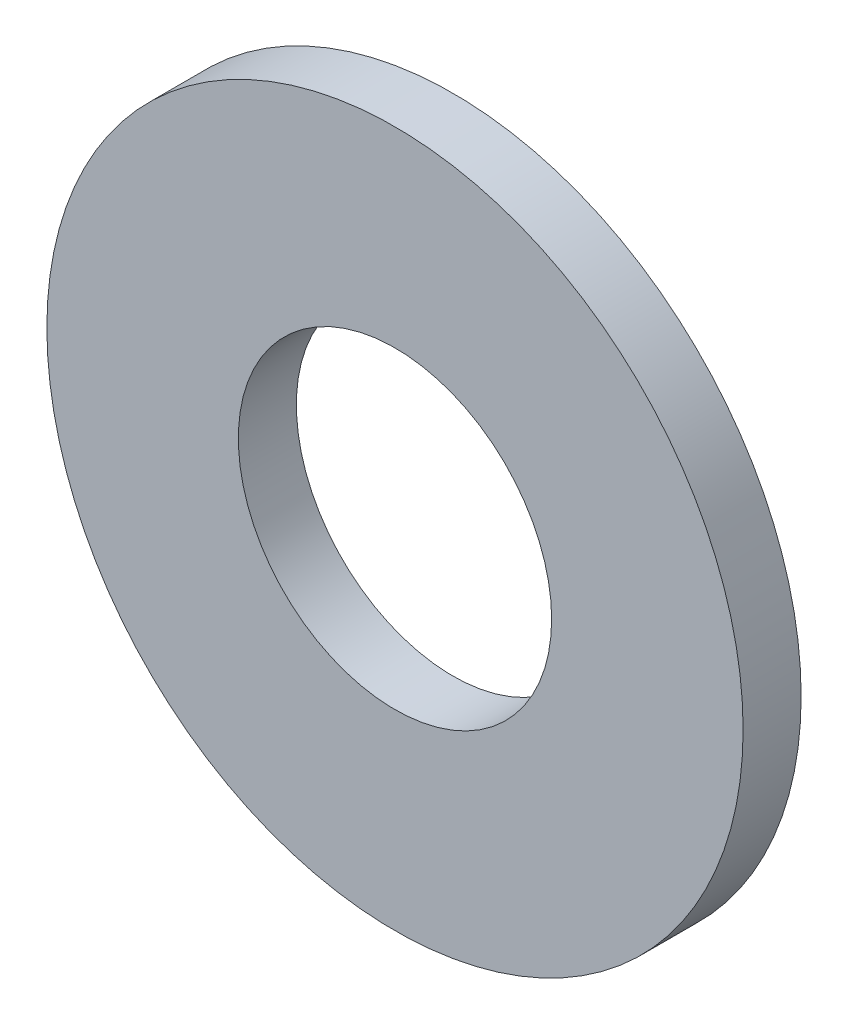
ISO-10303-21;
HEADER;
FILE_DESCRIPTION(('STEP AP214'),'2;1');
FILE_NAME('part.step','',(''),(''),'','','');
FILE_SCHEMA(('AUTOMOTIVE_DESIGN { 1 0 10303 214 1 1 1 1 }'));
ENDSEC;
DATA;
#1=APPLICATION_CONTEXT('core data for automotive mechanical design processes');
#2=APPLICATION_PROTOCOL_DEFINITION('international standard','automotive_design',2000,#1);
#3=PRODUCT_CONTEXT('',#1,'mechanical');
#4=PRODUCT('Part','Part','',(#3));
#5=PRODUCT_RELATED_PRODUCT_CATEGORY('part','',(#4));
#6=PRODUCT_DEFINITION_FORMATION('','',#4);
#7=PRODUCT_DEFINITION_CONTEXT('part definition',#1,'design');
#8=PRODUCT_DEFINITION('design','',#6,#7);
#9=PRODUCT_DEFINITION_SHAPE('','',#8);
#10=(LENGTH_UNIT() NAMED_UNIT(*) SI_UNIT(.MILLI.,.METRE.));
#11=(NAMED_UNIT(*) PLANE_ANGLE_UNIT() SI_UNIT($,.RADIAN.));
#12=(NAMED_UNIT(*) SI_UNIT($,.STERADIAN.) SOLID_ANGLE_UNIT());
#13=UNCERTAINTY_MEASURE_WITH_UNIT(LENGTH_MEASURE(1.E-05),#10,'distance_accuracy_value','');
#14=(GEOMETRIC_REPRESENTATION_CONTEXT(3) GLOBAL_UNCERTAINTY_ASSIGNED_CONTEXT((#13)) GLOBAL_UNIT_ASSIGNED_CONTEXT((#10,
#11,#12)) REPRESENTATION_CONTEXT('',''));
#15=CARTESIAN_POINT('',(0.,0.,0.));
#16=DIRECTION('',(0.,0.,1.));
#17=DIRECTION('',(1.,0.,0.));
#18=AXIS2_PLACEMENT_3D('',#15,#16,#17);
#19=CARTESIAN_POINT('',(0.,0.,0.5));
#20=DIRECTION('',(0.,0.,1.));
#21=DIRECTION('',(1.,0.,0.));
#22=AXIS2_PLACEMENT_3D('',#19,#20,#21);
#23=PLANE('',#22);
#24=CARTESIAN_POINT('',(0.,0.,0.5));
#25=DIRECTION('',(0.,0.,1.));
#26=DIRECTION('',(1.,0.,0.));
#27=AXIS2_PLACEMENT_3D('',#24,#25,#26);
#28=CIRCLE('',#27,3.);
#29=CARTESIAN_POINT('',(3.,0.,0.5));
#30=VERTEX_POINT('',#29);
#31=EDGE_CURVE('E10',#30,#30,#28,.T.);
#32=ORIENTED_EDGE('',*,*,#31,.T.);
#33=EDGE_LOOP('',(#32));
#34=FACE_BOUND('',#33,.T.);
#35=CARTESIAN_POINT('',(0.,0.,0.5));
#36=DIRECTION('',(0.,0.,1.));
#37=DIRECTION('',(1.,0.,0.));
#38=AXIS2_PLACEMENT_3D('',#35,#36,#37);
#39=CIRCLE('',#38,1.35);
#40=CARTESIAN_POINT('',(1.35,0.,0.5));
#41=VERTEX_POINT('',#40);
#42=EDGE_CURVE('E38',#41,#41,#39,.T.);
#43=ORIENTED_EDGE('',*,*,#42,.F.);
#44=EDGE_LOOP('',(#43));
#45=FACE_BOUND('',#44,.T.);
#46=ADVANCED_FACE('F27',(#34,#45),#23,.T.);
#47=CARTESIAN_POINT('',(0.,0.,0.));
#48=DIRECTION('',(0.,0.,1.));
#49=DIRECTION('',(1.,0.,0.));
#50=AXIS2_PLACEMENT_3D('',#47,#48,#49);
#51=PLANE('',#50);
#52=CARTESIAN_POINT('',(0.,0.,0.));
#53=DIRECTION('',(0.,0.,1.));
#54=DIRECTION('',(1.,0.,0.));
#55=AXIS2_PLACEMENT_3D('',#52,#53,#54);
#56=CIRCLE('',#55,3.);
#57=CARTESIAN_POINT('',(3.,0.,0.));
#58=VERTEX_POINT('',#57);
#59=EDGE_CURVE('E34',#58,#58,#56,.T.);
#60=ORIENTED_EDGE('',*,*,#59,.F.);
#61=EDGE_LOOP('',(#60));
#62=FACE_BOUND('',#61,.T.);
#63=CARTESIAN_POINT('',(0.,0.,0.));
#64=DIRECTION('',(0.,0.,1.));
#65=DIRECTION('',(1.,0.,0.));
#66=AXIS2_PLACEMENT_3D('',#63,#64,#65);
#67=CIRCLE('',#66,1.35);
#68=CARTESIAN_POINT('',(1.35,0.,0.));
#69=VERTEX_POINT('',#68);
#70=EDGE_CURVE('E42',#69,#69,#67,.T.);
#71=ORIENTED_EDGE('',*,*,#70,.T.);
#72=EDGE_LOOP('',(#71));
#73=FACE_BOUND('',#72,.T.);
#74=ADVANCED_FACE('F48',(#62,#73),#51,.F.);
#75=CARTESIAN_POINT('',(0.,0.,0.5));
#76=DIRECTION('',(0.,0.,-1.));
#77=DIRECTION('',(-1.,0.,0.));
#78=AXIS2_PLACEMENT_3D('',#75,#76,#77);
#79=CYLINDRICAL_SURFACE('',#78,3.);
#80=ORIENTED_EDGE('',*,*,#31,.F.);
#81=EDGE_LOOP('',(#80));
#82=FACE_BOUND('',#81,.T.);
#83=ORIENTED_EDGE('',*,*,#59,.T.);
#84=EDGE_LOOP('',(#83));
#85=FACE_BOUND('',#84,.T.);
#86=ADVANCED_FACE('F29',(#82,#85),#79,.T.);
#87=CARTESIAN_POINT('',(0.,0.,0.5));
#88=DIRECTION('',(0.,0.,-1.));
#89=DIRECTION('',(-1.,0.,0.));
#90=AXIS2_PLACEMENT_3D('',#87,#88,#89);
#91=CYLINDRICAL_SURFACE('',#90,1.35);
#92=ORIENTED_EDGE('',*,*,#42,.T.);
#93=EDGE_LOOP('',(#92));
#94=FACE_BOUND('',#93,.T.);
#95=ORIENTED_EDGE('',*,*,#70,.F.);
#96=EDGE_LOOP('',(#95));
#97=FACE_BOUND('',#96,.T.);
#98=ADVANCED_FACE('F50',(#94,#97),#91,.F.);
#99=CLOSED_SHELL('',(#46,#74,#86,#98));
#100=MANIFOLD_SOLID_BREP('B2',#99);
#101=ADVANCED_BREP_SHAPE_REPRESENTATION('',(#18,#100),#14);
#102=SHAPE_DEFINITION_REPRESENTATION(#9,#101);
ENDSEC;
END-ISO-10303-21;
